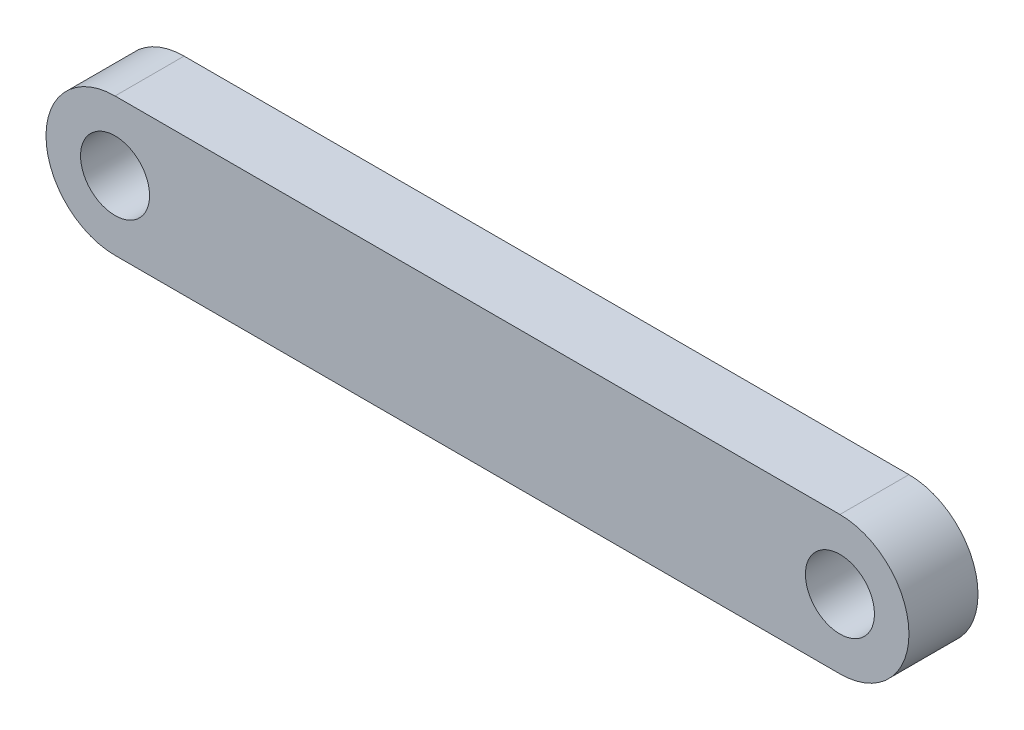
ISO-10303-21;
HEADER;
FILE_DESCRIPTION(('STEP AP214'),'2;1');
FILE_NAME('part.step','',(''),(''),'','','');
FILE_SCHEMA(('AUTOMOTIVE_DESIGN { 1 0 10303 214 1 1 1 1 }'));
ENDSEC;
DATA;
#1=APPLICATION_CONTEXT('core data for automotive mechanical design processes');
#2=APPLICATION_PROTOCOL_DEFINITION('international standard','automotive_design',2000,#1);
#3=PRODUCT_CONTEXT('',#1,'mechanical');
#4=PRODUCT('Part','Part','',(#3));
#5=PRODUCT_RELATED_PRODUCT_CATEGORY('part','',(#4));
#6=PRODUCT_DEFINITION_FORMATION('','',#4);
#7=PRODUCT_DEFINITION_CONTEXT('part definition',#1,'design');
#8=PRODUCT_DEFINITION('design','',#6,#7);
#9=PRODUCT_DEFINITION_SHAPE('','',#8);
#10=(LENGTH_UNIT() NAMED_UNIT(*) SI_UNIT(.MILLI.,.METRE.));
#11=(NAMED_UNIT(*) PLANE_ANGLE_UNIT() SI_UNIT($,.RADIAN.));
#12=(NAMED_UNIT(*) SI_UNIT($,.STERADIAN.) SOLID_ANGLE_UNIT());
#13=UNCERTAINTY_MEASURE_WITH_UNIT(LENGTH_MEASURE(1.E-05),#10,'distance_accuracy_value','');
#14=(GEOMETRIC_REPRESENTATION_CONTEXT(3) GLOBAL_UNCERTAINTY_ASSIGNED_CONTEXT((#13)) GLOBAL_UNIT_ASSIGNED_CONTEXT((#10,
#11,#12)) REPRESENTATION_CONTEXT('',''));
#15=CARTESIAN_POINT('',(0.,0.,0.));
#16=DIRECTION('',(0.,0.,1.));
#17=DIRECTION('',(1.,0.,0.));
#18=AXIS2_PLACEMENT_3D('',#15,#16,#17);
#19=CARTESIAN_POINT('',(0.,0.,20.));
#20=DIRECTION('',(0.,0.,1.));
#21=DIRECTION('',(1.,0.,0.));
#22=AXIS2_PLACEMENT_3D('',#19,#20,#21);
#23=PLANE('',#22);
#24=CARTESIAN_POINT('',(0.,0.,20.));
#25=DIRECTION('',(0.,0.,1.));
#26=DIRECTION('',(1.,0.,0.));
#27=AXIS2_PLACEMENT_3D('',#24,#25,#26);
#28=CIRCLE('',#27,10.);
#29=CARTESIAN_POINT('',(10.,0.,20.));
#30=VERTEX_POINT('',#29);
#31=EDGE_CURVE('E103',#30,#30,#28,.T.);
#32=ORIENTED_EDGE('',*,*,#31,.F.);
#33=EDGE_LOOP('',(#32));
#34=FACE_BOUND('',#33,.T.);
#35=CARTESIAN_POINT('',(0.,0.,20.));
#36=DIRECTION('',(0.,0.,1.));
#37=DIRECTION('',(1.,0.,0.));
#38=AXIS2_PLACEMENT_3D('',#35,#36,#37);
#39=CIRCLE('',#38,20.);
#40=CARTESIAN_POINT('',(0.,20.,20.));
#41=VERTEX_POINT('',#40);
#42=CARTESIAN_POINT('',(0.,-20.,20.));
#43=VERTEX_POINT('',#42);
#44=EDGE_CURVE('E88',#41,#43,#39,.T.);
#45=ORIENTED_EDGE('',*,*,#44,.T.);
#46=DIRECTION('',(1.,0.,0.));
#47=VECTOR('',#46,1.);
#48=CARTESIAN_POINT('',(210.,-20.,20.));
#49=LINE('',#48,#47);
#50=CARTESIAN_POINT('',(210.,-20.,20.));
#51=VERTEX_POINT('',#50);
#52=EDGE_CURVE('E83',#43,#51,#49,.T.);
#53=ORIENTED_EDGE('',*,*,#52,.T.);
#54=CARTESIAN_POINT('',(210.,0.,20.));
#55=DIRECTION('',(0.,0.,1.));
#56=DIRECTION('',(1.,0.,0.));
#57=AXIS2_PLACEMENT_3D('',#54,#55,#56);
#58=CIRCLE('',#57,20.);
#59=CARTESIAN_POINT('',(210.,20.,20.));
#60=VERTEX_POINT('',#59);
#61=EDGE_CURVE('E86',#51,#60,#58,.T.);
#62=ORIENTED_EDGE('',*,*,#61,.T.);
#63=DIRECTION('',(-1.,0.,0.));
#64=VECTOR('',#63,1.);
#65=CARTESIAN_POINT('',(0.,20.,20.));
#66=LINE('',#65,#64);
#67=EDGE_CURVE('E53',#60,#41,#66,.T.);
#68=ORIENTED_EDGE('',*,*,#67,.T.);
#69=EDGE_LOOP('',(#45,#53,#62,#68));
#70=FACE_BOUND('',#69,.T.);
#71=CARTESIAN_POINT('',(210.,0.,20.));
#72=DIRECTION('',(0.,0.,1.));
#73=DIRECTION('',(1.,0.,0.));
#74=AXIS2_PLACEMENT_3D('',#71,#72,#73);
#75=CIRCLE('',#74,10.);
#76=CARTESIAN_POINT('',(220.,0.,20.));
#77=VERTEX_POINT('',#76);
#78=EDGE_CURVE('E118',#77,#77,#75,.T.);
#79=ORIENTED_EDGE('',*,*,#78,.F.);
#80=EDGE_LOOP('',(#79));
#81=FACE_BOUND('',#80,.T.);
#82=ADVANCED_FACE('F36',(#34,#70,#81),#23,.T.);
#83=CARTESIAN_POINT('',(0.,0.,0.));
#84=DIRECTION('',(0.,0.,1.));
#85=DIRECTION('',(1.,0.,0.));
#86=AXIS2_PLACEMENT_3D('',#83,#84,#85);
#87=PLANE('',#86);
#88=CARTESIAN_POINT('',(0.,0.,0.));
#89=DIRECTION('',(0.,0.,1.));
#90=DIRECTION('',(1.,0.,0.));
#91=AXIS2_PLACEMENT_3D('',#88,#89,#90);
#92=CIRCLE('',#91,20.);
#93=CARTESIAN_POINT('',(0.,20.,0.));
#94=VERTEX_POINT('',#93);
#95=CARTESIAN_POINT('',(0.,-20.,0.));
#96=VERTEX_POINT('',#95);
#97=EDGE_CURVE('E100',#94,#96,#92,.T.);
#98=ORIENTED_EDGE('',*,*,#97,.F.);
#99=DIRECTION('',(-1.,0.,0.));
#100=VECTOR('',#99,1.);
#101=CARTESIAN_POINT('',(0.,20.,0.));
#102=LINE('',#101,#100);
#103=CARTESIAN_POINT('',(210.,20.,0.));
#104=VERTEX_POINT('',#103);
#105=EDGE_CURVE('E76',#104,#94,#102,.T.);
#106=ORIENTED_EDGE('',*,*,#105,.F.);
#107=CARTESIAN_POINT('',(210.,0.,0.));
#108=DIRECTION('',(0.,0.,1.));
#109=DIRECTION('',(1.,0.,0.));
#110=AXIS2_PLACEMENT_3D('',#107,#108,#109);
#111=CIRCLE('',#110,20.);
#112=CARTESIAN_POINT('',(210.,-20.,0.));
#113=VERTEX_POINT('',#112);
#114=EDGE_CURVE('E70',#113,#104,#111,.T.);
#115=ORIENTED_EDGE('',*,*,#114,.F.);
#116=DIRECTION('',(1.,0.,0.));
#117=VECTOR('',#116,1.);
#118=CARTESIAN_POINT('',(210.,-20.,0.));
#119=LINE('',#118,#117);
#120=EDGE_CURVE('E92',#96,#113,#119,.T.);
#121=ORIENTED_EDGE('',*,*,#120,.F.);
#122=EDGE_LOOP('',(#98,#106,#115,#121));
#123=FACE_BOUND('',#122,.T.);
#124=CARTESIAN_POINT('',(0.,0.,0.));
#125=DIRECTION('',(0.,0.,1.));
#126=DIRECTION('',(1.,0.,0.));
#127=AXIS2_PLACEMENT_3D('',#124,#125,#126);
#128=CIRCLE('',#127,10.);
#129=CARTESIAN_POINT('',(10.,0.,0.));
#130=VERTEX_POINT('',#129);
#131=EDGE_CURVE('E115',#130,#130,#128,.T.);
#132=ORIENTED_EDGE('',*,*,#131,.T.);
#133=EDGE_LOOP('',(#132));
#134=FACE_BOUND('',#133,.T.);
#135=CARTESIAN_POINT('',(210.,0.,0.));
#136=DIRECTION('',(0.,0.,1.));
#137=DIRECTION('',(1.,0.,0.));
#138=AXIS2_PLACEMENT_3D('',#135,#136,#137);
#139=CIRCLE('',#138,10.);
#140=CARTESIAN_POINT('',(220.,0.,0.));
#141=VERTEX_POINT('',#140);
#142=EDGE_CURVE('E121',#141,#141,#139,.T.);
#143=ORIENTED_EDGE('',*,*,#142,.T.);
#144=EDGE_LOOP('',(#143));
#145=FACE_BOUND('',#144,.T.);
#146=ADVANCED_FACE('F111',(#123,#134,#145),#87,.F.);
#147=CARTESIAN_POINT('',(0.,0.,20.));
#148=DIRECTION('',(0.,0.,-1.));
#149=DIRECTION('',(-1.,0.,0.));
#150=AXIS2_PLACEMENT_3D('',#147,#148,#149);
#151=CYLINDRICAL_SURFACE('',#150,20.);
#152=ORIENTED_EDGE('',*,*,#97,.T.);
#153=DIRECTION('',(0.,0.,-1.));
#154=VECTOR('',#153,1.);
#155=CARTESIAN_POINT('',(0.,-20.,20.));
#156=LINE('',#155,#154);
#157=EDGE_CURVE('E11',#43,#96,#156,.T.);
#158=ORIENTED_EDGE('',*,*,#157,.F.);
#159=ORIENTED_EDGE('',*,*,#44,.F.);
#160=DIRECTION('',(0.,0.,-1.));
#161=VECTOR('',#160,1.);
#162=CARTESIAN_POINT('',(0.,20.,20.));
#163=LINE('',#162,#161);
#164=EDGE_CURVE('E96',#41,#94,#163,.T.);
#165=ORIENTED_EDGE('',*,*,#164,.T.);
#166=EDGE_LOOP('',(#152,#158,#159,#165));
#167=FACE_BOUND('',#166,.T.);
#168=ADVANCED_FACE('F38',(#167),#151,.T.);
#169=CARTESIAN_POINT('',(210.,-20.,20.));
#170=DIRECTION('',(0.,1.,0.));
#171=DIRECTION('',(-1.,0.,0.));
#172=AXIS2_PLACEMENT_3D('',#169,#170,#171);
#173=PLANE('',#172);
#174=ORIENTED_EDGE('',*,*,#120,.T.);
#175=DIRECTION('',(0.,0.,-1.));
#176=VECTOR('',#175,1.);
#177=CARTESIAN_POINT('',(210.,-20.,20.));
#178=LINE('',#177,#176);
#179=EDGE_CURVE('E45',#51,#113,#178,.T.);
#180=ORIENTED_EDGE('',*,*,#179,.F.);
#181=ORIENTED_EDGE('',*,*,#52,.F.);
#182=ORIENTED_EDGE('',*,*,#157,.T.);
#183=EDGE_LOOP('',(#174,#180,#181,#182));
#184=FACE_BOUND('',#183,.T.);
#185=ADVANCED_FACE('F91',(#184),#173,.F.);
#186=CARTESIAN_POINT('',(210.,0.,20.));
#187=DIRECTION('',(0.,0.,-1.));
#188=DIRECTION('',(-1.,0.,0.));
#189=AXIS2_PLACEMENT_3D('',#186,#187,#188);
#190=CYLINDRICAL_SURFACE('',#189,20.);
#191=ORIENTED_EDGE('',*,*,#114,.T.);
#192=DIRECTION('',(0.,0.,-1.));
#193=VECTOR('',#192,1.);
#194=CARTESIAN_POINT('',(210.,20.,20.));
#195=LINE('',#194,#193);
#196=EDGE_CURVE('E93',#60,#104,#195,.T.);
#197=ORIENTED_EDGE('',*,*,#196,.F.);
#198=ORIENTED_EDGE('',*,*,#61,.F.);
#199=ORIENTED_EDGE('',*,*,#179,.T.);
#200=EDGE_LOOP('',(#191,#197,#198,#199));
#201=FACE_BOUND('',#200,.T.);
#202=ADVANCED_FACE('F94',(#201),#190,.T.);
#203=CARTESIAN_POINT('',(0.,20.,20.));
#204=DIRECTION('',(0.,-1.,0.));
#205=DIRECTION('',(1.,0.,0.));
#206=AXIS2_PLACEMENT_3D('',#203,#204,#205);
#207=PLANE('',#206);
#208=ORIENTED_EDGE('',*,*,#105,.T.);
#209=ORIENTED_EDGE('',*,*,#164,.F.);
#210=ORIENTED_EDGE('',*,*,#67,.F.);
#211=ORIENTED_EDGE('',*,*,#196,.T.);
#212=EDGE_LOOP('',(#208,#209,#210,#211));
#213=FACE_BOUND('',#212,.T.);
#214=ADVANCED_FACE('F108',(#213),#207,.F.);
#215=CARTESIAN_POINT('',(0.,0.,20.));
#216=DIRECTION('',(0.,0.,-1.));
#217=DIRECTION('',(-1.,0.,0.));
#218=AXIS2_PLACEMENT_3D('',#215,#216,#217);
#219=CYLINDRICAL_SURFACE('',#218,10.);
#220=ORIENTED_EDGE('',*,*,#31,.T.);
#221=EDGE_LOOP('',(#220));
#222=FACE_BOUND('',#221,.T.);
#223=ORIENTED_EDGE('',*,*,#131,.F.);
#224=EDGE_LOOP('',(#223));
#225=FACE_BOUND('',#224,.T.);
#226=ADVANCED_FACE('F138',(#222,#225),#219,.F.);
#227=CARTESIAN_POINT('',(210.,0.,20.));
#228=DIRECTION('',(0.,0.,-1.));
#229=DIRECTION('',(-1.,0.,0.));
#230=AXIS2_PLACEMENT_3D('',#227,#228,#229);
#231=CYLINDRICAL_SURFACE('',#230,10.);
#232=ORIENTED_EDGE('',*,*,#78,.T.);
#233=EDGE_LOOP('',(#232));
#234=FACE_BOUND('',#233,.T.);
#235=ORIENTED_EDGE('',*,*,#142,.F.);
#236=EDGE_LOOP('',(#235));
#237=FACE_BOUND('',#236,.T.);
#238=ADVANCED_FACE('F127',(#234,#237),#231,.F.);
#239=CLOSED_SHELL('',(#82,#146,#168,#185,#202,#214,#226,#238));
#240=MANIFOLD_SOLID_BREP('B2',#239);
#241=ADVANCED_BREP_SHAPE_REPRESENTATION('',(#18,#240),#14);
#242=SHAPE_DEFINITION_REPRESENTATION(#9,#241);
ENDSEC;
END-ISO-10303-21;
